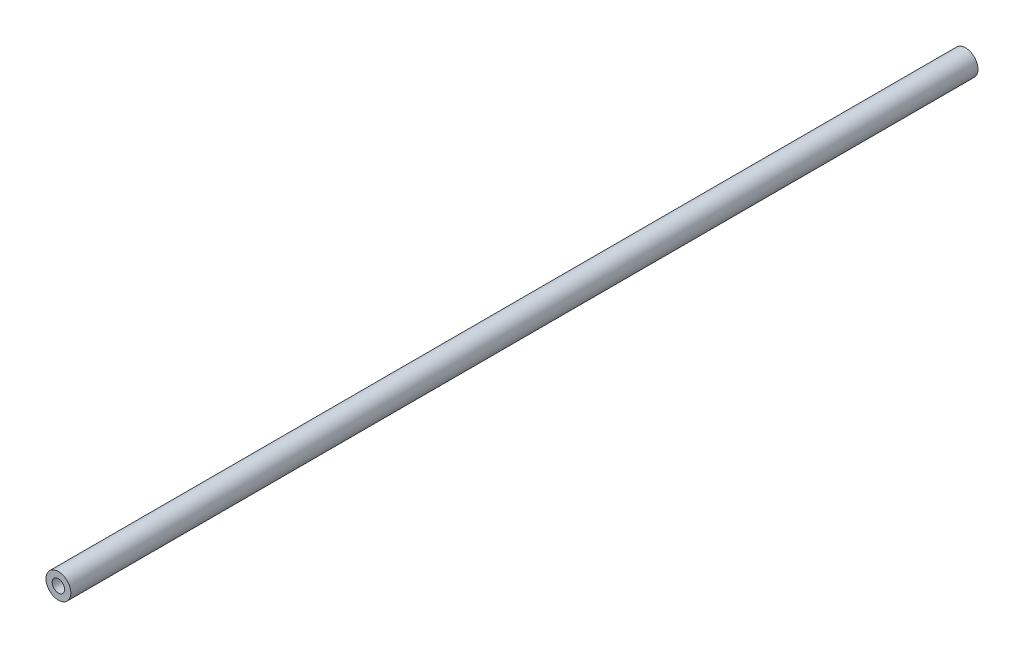
ISO-10303-21;
HEADER;
FILE_DESCRIPTION(('STEP AP214'),'2;1');
FILE_NAME('part.step','',(''),(''),'','','');
FILE_SCHEMA(('AUTOMOTIVE_DESIGN { 1 0 10303 214 1 1 1 1 }'));
ENDSEC;
DATA;
#1=APPLICATION_CONTEXT('core data for automotive mechanical design processes');
#2=APPLICATION_PROTOCOL_DEFINITION('international standard','automotive_design',2000,#1);
#3=PRODUCT_CONTEXT('',#1,'mechanical');
#4=PRODUCT('Part','Part','',(#3));
#5=PRODUCT_RELATED_PRODUCT_CATEGORY('part','',(#4));
#6=PRODUCT_DEFINITION_FORMATION('','',#4);
#7=PRODUCT_DEFINITION_CONTEXT('part definition',#1,'design');
#8=PRODUCT_DEFINITION('design','',#6,#7);
#9=PRODUCT_DEFINITION_SHAPE('','',#8);
#10=(LENGTH_UNIT() NAMED_UNIT(*) SI_UNIT(.MILLI.,.METRE.));
#11=(NAMED_UNIT(*) PLANE_ANGLE_UNIT() SI_UNIT($,.RADIAN.));
#12=(NAMED_UNIT(*) SI_UNIT($,.STERADIAN.) SOLID_ANGLE_UNIT());
#13=UNCERTAINTY_MEASURE_WITH_UNIT(LENGTH_MEASURE(1.E-05),#10,'distance_accuracy_value','');
#14=(GEOMETRIC_REPRESENTATION_CONTEXT(3) GLOBAL_UNCERTAINTY_ASSIGNED_CONTEXT((#13)) GLOBAL_UNIT_ASSIGNED_CONTEXT((#10,
#11,#12)) REPRESENTATION_CONTEXT('',''));
#15=CARTESIAN_POINT('',(0.,0.,0.));
#16=DIRECTION('',(0.,0.,1.));
#17=DIRECTION('',(1.,0.,0.));
#18=AXIS2_PLACEMENT_3D('',#15,#16,#17);
#19=CARTESIAN_POINT('',(0.,0.,292.));
#20=DIRECTION('',(0.,0.,1.));
#21=DIRECTION('',(1.,0.,0.));
#22=AXIS2_PLACEMENT_3D('',#19,#20,#21);
#23=PLANE('',#22);
#24=CARTESIAN_POINT('',(0.,0.,292.));
#25=DIRECTION('',(0.,0.,1.));
#26=DIRECTION('',(1.,0.,0.));
#27=AXIS2_PLACEMENT_3D('',#24,#25,#26);
#28=CIRCLE('',#27,4.);
#29=CARTESIAN_POINT('',(4.,0.,292.));
#30=VERTEX_POINT('',#29);
#31=EDGE_CURVE('E10',#30,#30,#28,.T.);
#32=ORIENTED_EDGE('',*,*,#31,.T.);
#33=EDGE_LOOP('',(#32));
#34=FACE_BOUND('',#33,.T.);
#35=CARTESIAN_POINT('',(0.,0.,292.));
#36=DIRECTION('',(0.,0.,1.));
#37=DIRECTION('',(1.,0.,0.));
#38=AXIS2_PLACEMENT_3D('',#35,#36,#37);
#39=CIRCLE('',#38,2.);
#40=CARTESIAN_POINT('',(2.,0.,292.));
#41=VERTEX_POINT('',#40);
#42=EDGE_CURVE('E41',#41,#41,#39,.T.);
#43=ORIENTED_EDGE('',*,*,#42,.F.);
#44=EDGE_LOOP('',(#43));
#45=FACE_BOUND('',#44,.T.);
#46=ADVANCED_FACE('F30',(#34,#45),#23,.T.);
#47=CARTESIAN_POINT('',(0.,0.,0.));
#48=DIRECTION('',(0.,0.,1.));
#49=DIRECTION('',(1.,0.,0.));
#50=AXIS2_PLACEMENT_3D('',#47,#48,#49);
#51=PLANE('',#50);
#52=CARTESIAN_POINT('',(0.,0.,0.));
#53=DIRECTION('',(0.,0.,1.));
#54=DIRECTION('',(1.,0.,0.));
#55=AXIS2_PLACEMENT_3D('',#52,#53,#54);
#56=CIRCLE('',#55,4.);
#57=CARTESIAN_POINT('',(4.,0.,0.));
#58=VERTEX_POINT('',#57);
#59=EDGE_CURVE('E34',#58,#58,#56,.T.);
#60=ORIENTED_EDGE('',*,*,#59,.F.);
#61=EDGE_LOOP('',(#60));
#62=FACE_BOUND('',#61,.T.);
#63=CARTESIAN_POINT('',(0.,0.,0.));
#64=DIRECTION('',(0.,0.,1.));
#65=DIRECTION('',(1.,0.,0.));
#66=AXIS2_PLACEMENT_3D('',#63,#64,#65);
#67=CIRCLE('',#66,2.);
#68=CARTESIAN_POINT('',(2.,0.,0.));
#69=VERTEX_POINT('',#68);
#70=EDGE_CURVE('E43',#69,#69,#67,.T.);
#71=ORIENTED_EDGE('',*,*,#70,.T.);
#72=EDGE_LOOP('',(#71));
#73=FACE_BOUND('',#72,.T.);
#74=ADVANCED_FACE('F53',(#62,#73),#51,.F.);
#75=CARTESIAN_POINT('',(0.,0.,292.));
#76=DIRECTION('',(0.,0.,-1.));
#77=DIRECTION('',(-1.,0.,0.));
#78=AXIS2_PLACEMENT_3D('',#75,#76,#77);
#79=CYLINDRICAL_SURFACE('',#78,4.);
#80=ORIENTED_EDGE('',*,*,#31,.F.);
#81=EDGE_LOOP('',(#80));
#82=FACE_BOUND('',#81,.T.);
#83=ORIENTED_EDGE('',*,*,#59,.T.);
#84=EDGE_LOOP('',(#83));
#85=FACE_BOUND('',#84,.T.);
#86=ADVANCED_FACE('F32',(#82,#85),#79,.T.);
#87=CARTESIAN_POINT('',(0.,0.,292.));
#88=DIRECTION('',(0.,0.,-1.));
#89=DIRECTION('',(-1.,0.,0.));
#90=AXIS2_PLACEMENT_3D('',#87,#88,#89);
#91=CYLINDRICAL_SURFACE('',#90,2.);
#92=ORIENTED_EDGE('',*,*,#42,.T.);
#93=EDGE_LOOP('',(#92));
#94=FACE_BOUND('',#93,.T.);
#95=ORIENTED_EDGE('',*,*,#70,.F.);
#96=EDGE_LOOP('',(#95));
#97=FACE_BOUND('',#96,.T.);
#98=ADVANCED_FACE('F49',(#94,#97),#91,.F.);
#99=CLOSED_SHELL('',(#46,#74,#86,#98));
#100=MANIFOLD_SOLID_BREP('B2',#99);
#101=ADVANCED_BREP_SHAPE_REPRESENTATION('',(#18,#100),#14);
#102=SHAPE_DEFINITION_REPRESENTATION(#9,#101);
ENDSEC;
END-ISO-10303-21;
